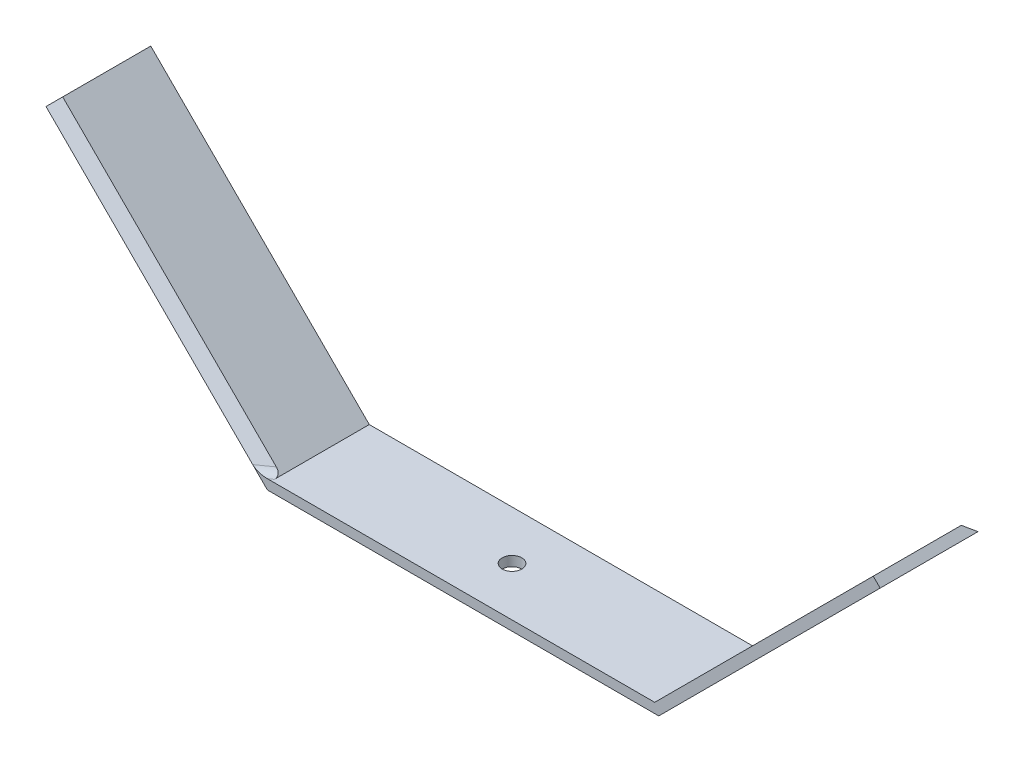
ISO-10303-21;
HEADER;
FILE_DESCRIPTION(('STEP AP214'),'2;1');
FILE_NAME('part.step','',(''),(''),'','','');
FILE_SCHEMA(('AUTOMOTIVE_DESIGN { 1 0 10303 214 1 1 1 1 }'));
ENDSEC;
DATA;
#1=APPLICATION_CONTEXT('core data for automotive mechanical design processes');
#2=APPLICATION_PROTOCOL_DEFINITION('international standard','automotive_design',2000,#1);
#3=PRODUCT_CONTEXT('',#1,'mechanical');
#4=PRODUCT('Part','Part','',(#3));
#5=PRODUCT_RELATED_PRODUCT_CATEGORY('part','',(#4));
#6=PRODUCT_DEFINITION_FORMATION('','',#4);
#7=PRODUCT_DEFINITION_CONTEXT('part definition',#1,'design');
#8=PRODUCT_DEFINITION('design','',#6,#7);
#9=PRODUCT_DEFINITION_SHAPE('','',#8);
#10=(LENGTH_UNIT() NAMED_UNIT(*) SI_UNIT(.MILLI.,.METRE.));
#11=(NAMED_UNIT(*) PLANE_ANGLE_UNIT() SI_UNIT($,.RADIAN.));
#12=(NAMED_UNIT(*) SI_UNIT($,.STERADIAN.) SOLID_ANGLE_UNIT());
#13=UNCERTAINTY_MEASURE_WITH_UNIT(LENGTH_MEASURE(1.E-05),#10,'distance_accuracy_value','');
#14=(GEOMETRIC_REPRESENTATION_CONTEXT(3) GLOBAL_UNCERTAINTY_ASSIGNED_CONTEXT((#13)) GLOBAL_UNIT_ASSIGNED_CONTEXT((#10,
#11,#12)) REPRESENTATION_CONTEXT('',''));
#15=CARTESIAN_POINT('',(0.,0.,0.));
#16=DIRECTION('',(0.,0.,1.));
#17=DIRECTION('',(1.,0.,0.));
#18=AXIS2_PLACEMENT_3D('',#15,#16,#17);
#19=CARTESIAN_POINT('',(-20.,0.,10.));
#20=DIRECTION('',(0.707106781186538,0.707106781186557,0.));
#21=DIRECTION('',(-0.707106781186557,0.707106781186538,0.));
#22=AXIS2_PLACEMENT_3D('',#19,#20,#21);
#23=PLANE('',#22);
#24=DIRECTION('',(0.707106781186557,-0.707106781186538,0.));
#25=VECTOR('',#24,1.);
#26=CARTESIAN_POINT('',(-20.,0.,0.));
#27=LINE('',#26,#25);
#28=CARTESIAN_POINT('',(-42.6274169979698,22.6274169979692,0.));
#29=VERTEX_POINT('',#28);
#30=CARTESIAN_POINT('',(-20.,0.,0.));
#31=VERTEX_POINT('',#30);
#32=EDGE_CURVE('E136',#29,#31,#27,.T.);
#33=ORIENTED_EDGE('',*,*,#32,.T.);
#34=DIRECTION('',(0.,0.,-1.));
#35=VECTOR('',#34,1.);
#36=CARTESIAN_POINT('',(-20.,0.,10.));
#37=LINE('',#36,#35);
#38=CARTESIAN_POINT('',(-20.,0.,10.));
#39=VERTEX_POINT('',#38);
#40=EDGE_CURVE('E128',#39,#31,#37,.T.);
#41=ORIENTED_EDGE('',*,*,#40,.F.);
#42=DIRECTION('',(0.707106781186557,-0.707106781186538,0.));
#43=VECTOR('',#42,1.);
#44=CARTESIAN_POINT('',(-20.,0.,10.));
#45=LINE('',#44,#43);
#46=CARTESIAN_POINT('',(-21.5,1.49999999999999,10.));
#47=VERTEX_POINT('',#46);
#48=EDGE_CURVE('E47',#47,#39,#45,.T.);
#49=ORIENTED_EDGE('',*,*,#48,.F.);
#50=CARTESIAN_POINT('',(-42.6274169979698,22.6274169979692,10.));
#51=VERTEX_POINT('',#50);
#52=EDGE_CURVE('E122',#51,#47,#45,.T.);
#53=ORIENTED_EDGE('',*,*,#52,.F.);
#54=DIRECTION('',(0.,0.,-1.));
#55=VECTOR('',#54,1.);
#56=CARTESIAN_POINT('',(-42.6274169979698,22.6274169979692,10.));
#57=LINE('',#56,#55);
#58=EDGE_CURVE('E198',#51,#29,#57,.T.);
#59=ORIENTED_EDGE('',*,*,#58,.T.);
#60=EDGE_LOOP('',(#33,#41,#49,#53,#59));
#61=FACE_BOUND('',#60,.T.);
#62=ADVANCED_FACE('F32',(#61),#23,.F.);
#63=CARTESIAN_POINT('',(20.,0.,10.));
#64=DIRECTION('',(0.,1.,0.));
#65=DIRECTION('',(0.,0.,1.));
#66=AXIS2_PLACEMENT_3D('',#63,#64,#65);
#67=PLANE('',#66);
#68=CARTESIAN_POINT('',(0.,0.,5.));
#69=DIRECTION('',(0.,1.,0.));
#70=DIRECTION('',(0.,0.,1.));
#71=AXIS2_PLACEMENT_3D('',#68,#69,#70);
#72=CIRCLE('',#71,1.);
#73=CARTESIAN_POINT('',(0.,0.,6.));
#74=VERTEX_POINT('',#73);
#75=EDGE_CURVE('E218',#74,#74,#72,.T.);
#76=ORIENTED_EDGE('',*,*,#75,.T.);
#77=EDGE_LOOP('',(#76));
#78=FACE_BOUND('',#77,.T.);
#79=DIRECTION('',(1.,0.,0.));
#80=VECTOR('',#79,1.);
#81=CARTESIAN_POINT('',(20.,0.,0.));
#82=LINE('',#81,#80);
#83=CARTESIAN_POINT('',(20.,0.,0.));
#84=VERTEX_POINT('',#83);
#85=EDGE_CURVE('E217',#31,#84,#82,.T.);
#86=ORIENTED_EDGE('',*,*,#85,.T.);
#87=DIRECTION('',(0.,0.,-1.));
#88=VECTOR('',#87,1.);
#89=CARTESIAN_POINT('',(20.,0.,10.));
#90=LINE('',#89,#88);
#91=CARTESIAN_POINT('',(20.,0.,10.));
#92=VERTEX_POINT('',#91);
#93=EDGE_CURVE('E130',#92,#84,#90,.T.);
#94=ORIENTED_EDGE('',*,*,#93,.F.);
#95=DIRECTION('',(1.,0.,0.));
#96=VECTOR('',#95,1.);
#97=CARTESIAN_POINT('',(20.,0.,10.));
#98=LINE('',#97,#96);
#99=EDGE_CURVE('E119',#39,#92,#98,.T.);
#100=ORIENTED_EDGE('',*,*,#99,.F.);
#101=ORIENTED_EDGE('',*,*,#40,.T.);
#102=EDGE_LOOP('',(#86,#94,#100,#101));
#103=FACE_BOUND('',#102,.T.);
#104=ADVANCED_FACE('F127',(#78,#103),#67,.F.);
#105=CARTESIAN_POINT('',(20.,0.,10.));
#106=DIRECTION('',(-0.707106781186538,0.707106781186557,0.));
#107=DIRECTION('',(-0.707106781186557,-0.707106781186538,0.));
#108=AXIS2_PLACEMENT_3D('',#105,#106,#107);
#109=PLANE('',#108);
#110=DIRECTION('',(0.707106781186557,0.707106781186538,0.));
#111=VECTOR('',#110,1.);
#112=CARTESIAN_POINT('',(20.,0.,0.));
#113=LINE('',#112,#111);
#114=CARTESIAN_POINT('',(21.5,1.49999999999999,0.));
#115=VERTEX_POINT('',#114);
#116=EDGE_CURVE('E55',#84,#115,#113,.T.);
#117=ORIENTED_EDGE('',*,*,#116,.T.);
#118=CARTESIAN_POINT('',(42.6274169979698,22.6274169979692,0.));
#119=VERTEX_POINT('',#118);
#120=EDGE_CURVE('E193',#115,#119,#113,.T.);
#121=ORIENTED_EDGE('',*,*,#120,.T.);
#122=DIRECTION('',(0.,0.,-1.));
#123=VECTOR('',#122,1.);
#124=CARTESIAN_POINT('',(42.6274169979698,22.6274169979692,10.));
#125=LINE('',#124,#123);
#126=CARTESIAN_POINT('',(42.6274169979698,22.6274169979692,10.));
#127=VERTEX_POINT('',#126);
#128=EDGE_CURVE('E142',#127,#119,#125,.T.);
#129=ORIENTED_EDGE('',*,*,#128,.F.);
#130=DIRECTION('',(0.707106781186557,0.707106781186538,0.));
#131=VECTOR('',#130,1.);
#132=CARTESIAN_POINT('',(20.,0.,10.));
#133=LINE('',#132,#131);
#134=EDGE_CURVE('E132',#92,#127,#133,.T.);
#135=ORIENTED_EDGE('',*,*,#134,.F.);
#136=ORIENTED_EDGE('',*,*,#93,.T.);
#137=EDGE_LOOP('',(#117,#121,#129,#135,#136));
#138=FACE_BOUND('',#137,.T.);
#139=ADVANCED_FACE('F251',(#138),#109,.F.);
#140=CARTESIAN_POINT('',(42.6274169979698,22.6274169979692,10.));
#141=DIRECTION('',(-0.707106781186556,-0.707106781186539,0.));
#142=DIRECTION('',(0.707106781186539,-0.707106781186556,0.));
#143=AXIS2_PLACEMENT_3D('',#140,#141,#142);
#144=PLANE('',#143);
#145=ORIENTED_EDGE('',*,*,#128,.T.);
#146=DIRECTION('',(-0.499999999999994,0.500000000000006,0.707106781186548));
#147=VECTOR('',#146,1.);
#148=CARTESIAN_POINT('',(41.9203102167833,23.3345237791558,1.));
#149=LINE('',#148,#147);
#150=CARTESIAN_POINT('',(41.9203102167833,23.3345237791558,1.));
#151=VERTEX_POINT('',#150);
#152=EDGE_CURVE('E140',#119,#151,#149,.T.);
#153=ORIENTED_EDGE('',*,*,#152,.T.);
#154=DIRECTION('',(0.,0.,-1.));
#155=VECTOR('',#154,1.);
#156=CARTESIAN_POINT('',(41.9203102167833,23.3345237791558,10.));
#157=LINE('',#156,#155);
#158=CARTESIAN_POINT('',(41.9203102167833,23.3345237791558,10.));
#159=VERTEX_POINT('',#158);
#160=EDGE_CURVE('E206',#159,#151,#157,.T.);
#161=ORIENTED_EDGE('',*,*,#160,.F.);
#162=DIRECTION('',(-0.707106781186539,0.707106781186556,0.));
#163=VECTOR('',#162,1.);
#164=CARTESIAN_POINT('',(42.6274169979698,22.6274169979692,10.));
#165=LINE('',#164,#163);
#166=EDGE_CURVE('E214',#127,#159,#165,.T.);
#167=ORIENTED_EDGE('',*,*,#166,.F.);
#168=EDGE_LOOP('',(#145,#153,#161,#167));
#169=FACE_BOUND('',#168,.T.);
#170=ADVANCED_FACE('F212',(#169),#144,.F.);
#171=CARTESIAN_POINT('',(41.9203102167833,23.3345237791558,10.));
#172=DIRECTION('',(0.707106781186538,-0.707106781186557,0.));
#173=DIRECTION('',(0.707106781186557,0.707106781186538,0.));
#174=AXIS2_PLACEMENT_3D('',#171,#172,#173);
#175=PLANE('',#174);
#176=ORIENTED_EDGE('',*,*,#160,.T.);
#177=DIRECTION('',(-0.707106781186557,-0.707106781186538,0.));
#178=VECTOR('',#177,1.);
#179=CARTESIAN_POINT('',(19.5857864376269,0.999999999999997,1.));
#180=LINE('',#179,#178);
#181=CARTESIAN_POINT('',(20.0857864376269,1.49999999999999,1.));
#182=VERTEX_POINT('',#181);
#183=EDGE_CURVE('E137',#151,#182,#180,.T.);
#184=ORIENTED_EDGE('',*,*,#183,.T.);
#185=CARTESIAN_POINT('',(20.5857864376269,2.,-0.414213562373096));
#186=DIRECTION('',(0.707106781186538,-0.707106781186557,0.));
#187=DIRECTION('',(0.500000000000013,0.5,-0.707106781186538));
#188=AXIS2_PLACEMENT_3D('',#185,#186,#187);
#189=ELLIPSE('',#188,1.73205080756889,1.);
#190=CARTESIAN_POINT('',(19.5857864376269,0.999999999999997,0.292893218813461));
#191=VERTEX_POINT('',#190);
#192=EDGE_CURVE('E165',#182,#191,#189,.T.);
#193=ORIENTED_EDGE('',*,*,#192,.T.);
#194=DIRECTION('',(0.,0.,-1.));
#195=VECTOR('',#194,1.);
#196=CARTESIAN_POINT('',(19.5857864376269,0.999999999999997,10.));
#197=LINE('',#196,#195);
#198=CARTESIAN_POINT('',(19.5857864376269,0.999999999999997,10.));
#199=VERTEX_POINT('',#198);
#200=EDGE_CURVE('E174',#199,#191,#197,.T.);
#201=ORIENTED_EDGE('',*,*,#200,.F.);
#202=DIRECTION('',(-0.707106781186557,-0.707106781186538,0.));
#203=VECTOR('',#202,1.);
#204=CARTESIAN_POINT('',(41.9203102167833,23.3345237791558,10.));
#205=LINE('',#204,#203);
#206=EDGE_CURVE('E222',#159,#199,#205,.T.);
#207=ORIENTED_EDGE('',*,*,#206,.F.);
#208=EDGE_LOOP('',(#176,#184,#193,#201,#207));
#209=FACE_BOUND('',#208,.T.);
#210=ADVANCED_FACE('F172',(#209),#175,.F.);
#211=CARTESIAN_POINT('',(-19.5857864376269,0.999999999999994,10.));
#212=DIRECTION('',(0.,-1.,0.));
#213=DIRECTION('',(1.,0.,0.));
#214=AXIS2_PLACEMENT_3D('',#211,#212,#213);
#215=PLANE('',#214);
#216=CARTESIAN_POINT('',(0.,0.999999999999996,5.));
#217=DIRECTION('',(0.,1.,0.));
#218=DIRECTION('',(-1.,0.,0.));
#219=AXIS2_PLACEMENT_3D('',#216,#217,#218);
#220=CIRCLE('',#219,1.);
#221=CARTESIAN_POINT('',(-1.,0.999999999999996,5.));
#222=VERTEX_POINT('',#221);
#223=EDGE_CURVE('E228',#222,#222,#220,.T.);
#224=ORIENTED_EDGE('',*,*,#223,.F.);
#225=EDGE_LOOP('',(#224));
#226=FACE_BOUND('',#225,.T.);
#227=ORIENTED_EDGE('',*,*,#200,.T.);
#228=DIRECTION('',(0.81649658092773,0.,-0.577350269189621));
#229=VECTOR('',#228,1.);
#230=CARTESIAN_POINT('',(-11.1045694996618,0.999999999999995,21.9942520190988));
#231=LINE('',#230,#229);
#232=CARTESIAN_POINT('',(20.,0.999999999999997,0.));
#233=VERTEX_POINT('',#232);
#234=EDGE_CURVE('E155',#191,#233,#231,.T.);
#235=ORIENTED_EDGE('',*,*,#234,.T.);
#236=DIRECTION('',(-1.,0.,0.));
#237=VECTOR('',#236,1.);
#238=CARTESIAN_POINT('',(-19.5857864376269,0.999999999999994,0.));
#239=LINE('',#238,#237);
#240=CARTESIAN_POINT('',(-19.5857864376269,0.999999999999994,0.));
#241=VERTEX_POINT('',#240);
#242=EDGE_CURVE('E183',#233,#241,#239,.T.);
#243=ORIENTED_EDGE('',*,*,#242,.T.);
#244=DIRECTION('',(0.,0.,-1.));
#245=VECTOR('',#244,1.);
#246=CARTESIAN_POINT('',(-19.5857864376269,0.999999999999994,10.));
#247=LINE('',#246,#245);
#248=CARTESIAN_POINT('',(-19.5857864376269,0.999999999999994,9.70710678118653));
#249=VERTEX_POINT('',#248);
#250=EDGE_CURVE('E203',#249,#241,#247,.T.);
#251=ORIENTED_EDGE('',*,*,#250,.F.);
#252=DIRECTION('',(0.816496580927731,0.,-0.577350269189619));
#253=VECTOR('',#252,1.);
#254=CARTESIAN_POINT('',(-19.7238576250846,0.999999999999994,9.80473785412435));
#255=LINE('',#254,#253);
#256=CARTESIAN_POINT('',(-20.,0.999999999999994,10.));
#257=VERTEX_POINT('',#256);
#258=EDGE_CURVE('E152',#249,#257,#255,.F.);
#259=ORIENTED_EDGE('',*,*,#258,.T.);
#260=DIRECTION('',(-1.,0.,0.));
#261=VECTOR('',#260,1.);
#262=CARTESIAN_POINT('',(-19.5857864376269,0.999999999999994,10.));
#263=LINE('',#262,#261);
#264=EDGE_CURVE('E201',#199,#257,#263,.T.);
#265=ORIENTED_EDGE('',*,*,#264,.F.);
#266=EDGE_LOOP('',(#227,#235,#243,#251,#259,#265));
#267=FACE_BOUND('',#266,.T.);
#268=ADVANCED_FACE('F182',(#226,#267),#215,.F.);
#269=CARTESIAN_POINT('',(-41.9203102167833,23.3345237791558,10.));
#270=DIRECTION('',(-0.707106781186538,-0.707106781186557,0.));
#271=DIRECTION('',(0.707106781186557,-0.707106781186538,0.));
#272=AXIS2_PLACEMENT_3D('',#269,#270,#271);
#273=PLANE('',#272);
#274=DIRECTION('',(0.,0.,-1.));
#275=VECTOR('',#274,1.);
#276=CARTESIAN_POINT('',(-41.9203102167833,23.3345237791558,10.));
#277=LINE('',#276,#275);
#278=CARTESIAN_POINT('',(-41.9203102167833,23.3345237791558,9.));
#279=VERTEX_POINT('',#278);
#280=CARTESIAN_POINT('',(-41.9203102167833,23.3345237791558,0.));
#281=VERTEX_POINT('',#280);
#282=EDGE_CURVE('E200',#279,#281,#277,.T.);
#283=ORIENTED_EDGE('',*,*,#282,.F.);
#284=DIRECTION('',(0.707106781186557,-0.707106781186538,0.));
#285=VECTOR('',#284,1.);
#286=CARTESIAN_POINT('',(-41.9203102167833,23.3345237791558,9.));
#287=LINE('',#286,#285);
#288=CARTESIAN_POINT('',(-20.0857864376269,1.49999999999999,9.));
#289=VERTEX_POINT('',#288);
#290=EDGE_CURVE('E149',#279,#289,#287,.T.);
#291=ORIENTED_EDGE('',*,*,#290,.T.);
#292=CARTESIAN_POINT('',(-20.5857864376269,1.99999999999999,10.4142135623731));
#293=DIRECTION('',(-0.707106781186538,-0.707106781186557,0.));
#294=DIRECTION('',(0.500000000000014,-0.500000000000001,-0.707106781186537));
#295=AXIS2_PLACEMENT_3D('',#292,#293,#294);
#296=ELLIPSE('',#295,1.73205080756889,1.);
#297=EDGE_CURVE('E11',#289,#249,#296,.T.);
#298=ORIENTED_EDGE('',*,*,#297,.T.);
#299=ORIENTED_EDGE('',*,*,#250,.T.);
#300=DIRECTION('',(-0.707106781186557,0.707106781186538,0.));
#301=VECTOR('',#300,1.);
#302=CARTESIAN_POINT('',(-41.9203102167833,23.3345237791558,0.));
#303=LINE('',#302,#301);
#304=EDGE_CURVE('E190',#241,#281,#303,.T.);
#305=ORIENTED_EDGE('',*,*,#304,.T.);
#306=EDGE_LOOP('',(#283,#291,#298,#299,#305));
#307=FACE_BOUND('',#306,.T.);
#308=ADVANCED_FACE('F236',(#307),#273,.F.);
#309=CARTESIAN_POINT('',(-42.6274169979698,22.6274169979692,10.));
#310=DIRECTION('',(0.707106781186568,-0.707106781186527,0.));
#311=DIRECTION('',(0.707106781186527,0.707106781186568,0.));
#312=AXIS2_PLACEMENT_3D('',#309,#310,#311);
#313=PLANE('',#312);
#314=ORIENTED_EDGE('',*,*,#58,.F.);
#315=DIRECTION('',(-0.499999999999986,-0.500000000000016,0.707106781186546));
#316=VECTOR('',#315,1.);
#317=CARTESIAN_POINT('',(-42.6274169979701,22.627416997969,10.0000000000004));
#318=LINE('',#317,#316);
#319=EDGE_CURVE('E147',#51,#279,#318,.F.);
#320=ORIENTED_EDGE('',*,*,#319,.T.);
#321=ORIENTED_EDGE('',*,*,#282,.T.);
#322=DIRECTION('',(-0.707106781186527,-0.707106781186568,0.));
#323=VECTOR('',#322,1.);
#324=CARTESIAN_POINT('',(-42.6274169979698,22.6274169979692,0.));
#325=LINE('',#324,#323);
#326=EDGE_CURVE('E123',#281,#29,#325,.T.);
#327=ORIENTED_EDGE('',*,*,#326,.T.);
#328=EDGE_LOOP('',(#314,#320,#321,#327));
#329=FACE_BOUND('',#328,.T.);
#330=ADVANCED_FACE('F242',(#329),#313,.F.);
#331=CARTESIAN_POINT('',(0.,0.,10.));
#332=DIRECTION('',(0.,0.,-1.));
#333=DIRECTION('',(-1.,0.,0.));
#334=AXIS2_PLACEMENT_3D('',#331,#332,#333);
#335=PLANE('',#334);
#336=ORIENTED_EDGE('',*,*,#264,.T.);
#337=CARTESIAN_POINT('',(-20.,1.99999999999999,10.));
#338=DIRECTION('',(0.,0.,-1.));
#339=DIRECTION('',(1.,0.,0.));
#340=AXIS2_PLACEMENT_3D('',#337,#338,#339);
#341=ELLIPSE('',#340,1.7320508075689,1.);
#342=EDGE_CURVE('E40',#257,#47,#341,.T.);
#343=ORIENTED_EDGE('',*,*,#342,.T.);
#344=ORIENTED_EDGE('',*,*,#48,.T.);
#345=ORIENTED_EDGE('',*,*,#99,.T.);
#346=ORIENTED_EDGE('',*,*,#134,.T.);
#347=ORIENTED_EDGE('',*,*,#166,.T.);
#348=ORIENTED_EDGE('',*,*,#206,.T.);
#349=EDGE_LOOP('',(#336,#343,#344,#345,#346,#347,#348));
#350=FACE_BOUND('',#349,.T.);
#351=ADVANCED_FACE('F118',(#350),#335,.F.);
#352=CARTESIAN_POINT('',(0.,0.,0.));
#353=DIRECTION('',(0.,0.,-1.));
#354=DIRECTION('',(-1.,0.,0.));
#355=AXIS2_PLACEMENT_3D('',#352,#353,#354);
#356=PLANE('',#355);
#357=ORIENTED_EDGE('',*,*,#242,.F.);
#358=CARTESIAN_POINT('',(20.,2.,0.));
#359=DIRECTION('',(0.,0.,-1.));
#360=DIRECTION('',(1.,0.,0.));
#361=AXIS2_PLACEMENT_3D('',#358,#359,#360);
#362=ELLIPSE('',#361,1.73205080756889,1.);
#363=EDGE_CURVE('E162',#233,#115,#362,.F.);
#364=ORIENTED_EDGE('',*,*,#363,.T.);
#365=ORIENTED_EDGE('',*,*,#116,.F.);
#366=ORIENTED_EDGE('',*,*,#85,.F.);
#367=ORIENTED_EDGE('',*,*,#32,.F.);
#368=ORIENTED_EDGE('',*,*,#326,.F.);
#369=ORIENTED_EDGE('',*,*,#304,.F.);
#370=EDGE_LOOP('',(#357,#364,#365,#366,#367,#368,#369));
#371=FACE_BOUND('',#370,.T.);
#372=ADVANCED_FACE('F187',(#371),#356,.T.);
#373=CARTESIAN_POINT('',(41.9203102167833,23.3345237791558,1.));
#374=DIRECTION('',(-0.499999999999993,0.500000000000007,-0.707106781186547));
#375=DIRECTION('',(0.707106781186557,0.707106781186538,0.));
#376=AXIS2_PLACEMENT_3D('',#373,#374,#375);
#377=PLANE('',#376);
#378=ORIENTED_EDGE('',*,*,#120,.F.);
#379=DIRECTION('',(0.81649658092773,0.,-0.577350269189621));
#380=VECTOR('',#379,1.);
#381=CARTESIAN_POINT('',(34.6421356237313,1.49999999999999,-9.29289321881354));
#382=LINE('',#381,#380);
#383=EDGE_CURVE('E158',#115,#182,#382,.F.);
#384=ORIENTED_EDGE('',*,*,#383,.T.);
#385=ORIENTED_EDGE('',*,*,#183,.F.);
#386=ORIENTED_EDGE('',*,*,#152,.F.);
#387=EDGE_LOOP('',(#378,#384,#385,#386));
#388=FACE_BOUND('',#387,.T.);
#389=ADVANCED_FACE('F216',(#388),#377,.T.);
#390=CARTESIAN_POINT('',(-9.99999999999974,-10.,10.));
#391=DIRECTION('',(-0.499999999999993,-0.500000000000006,-0.707106781186549));
#392=DIRECTION('',(-0.707106781186557,0.707106781186538,0.));
#393=AXIS2_PLACEMENT_3D('',#390,#391,#392);
#394=PLANE('',#393);
#395=ORIENTED_EDGE('',*,*,#52,.T.);
#396=DIRECTION('',(-0.816496580927731,0.,0.577350269189619));
#397=VECTOR('',#396,1.);
#398=CARTESIAN_POINT('',(-13.8333333333331,1.49999999999999,4.57884801090303));
#399=LINE('',#398,#397);
#400=EDGE_CURVE('E160',#47,#289,#399,.F.);
#401=ORIENTED_EDGE('',*,*,#400,.T.);
#402=ORIENTED_EDGE('',*,*,#290,.F.);
#403=ORIENTED_EDGE('',*,*,#319,.F.);
#404=EDGE_LOOP('',(#395,#401,#402,#403));
#405=FACE_BOUND('',#404,.T.);
#406=ADVANCED_FACE('F258',(#405),#394,.F.);
#407=CARTESIAN_POINT('',(-11.1045694996618,1.99999999999999,21.9942520190988));
#408=DIRECTION('',(0.816496580927729,0.,-0.577350269189621));
#409=DIRECTION('',(-0.577350269189621,0.,-0.81649658092773));
#410=AXIS2_PLACEMENT_3D('',#407,#408,#409);
#411=CYLINDRICAL_SURFACE('',#410,1.);
#412=ORIENTED_EDGE('',*,*,#192,.F.);
#413=ORIENTED_EDGE('',*,*,#383,.F.);
#414=ORIENTED_EDGE('',*,*,#363,.F.);
#415=ORIENTED_EDGE('',*,*,#234,.F.);
#416=EDGE_LOOP('',(#412,#413,#414,#415));
#417=FACE_BOUND('',#416,.T.);
#418=ADVANCED_FACE('F179',(#417),#411,.F.);
#419=CARTESIAN_POINT('',(-19.7238576250846,1.99999999999999,9.80473785412435));
#420=DIRECTION('',(0.81649658092773,0.,-0.577350269189619));
#421=DIRECTION('',(-0.577350269189619,0.,-0.816496580927731));
#422=AXIS2_PLACEMENT_3D('',#419,#420,#421);
#423=CYLINDRICAL_SURFACE('',#422,1.);
#424=ORIENTED_EDGE('',*,*,#297,.F.);
#425=ORIENTED_EDGE('',*,*,#400,.F.);
#426=ORIENTED_EDGE('',*,*,#342,.F.);
#427=ORIENTED_EDGE('',*,*,#258,.F.);
#428=EDGE_LOOP('',(#424,#425,#426,#427));
#429=FACE_BOUND('',#428,.T.);
#430=ADVANCED_FACE('F34',(#429),#423,.F.);
#431=CARTESIAN_POINT('',(0.,-9.00000000000001,5.));
#432=DIRECTION('',(0.,1.,0.));
#433=DIRECTION('',(-1.,0.,0.));
#434=AXIS2_PLACEMENT_3D('',#431,#432,#433);
#435=CYLINDRICAL_SURFACE('',#434,1.);
#436=ORIENTED_EDGE('',*,*,#223,.T.);
#437=EDGE_LOOP('',(#436));
#438=FACE_BOUND('',#437,.T.);
#439=ORIENTED_EDGE('',*,*,#75,.F.);
#440=EDGE_LOOP('',(#439));
#441=FACE_BOUND('',#440,.T.);
#442=ADVANCED_FACE('F232',(#438,#441),#435,.F.);
#443=CLOSED_SHELL('',(#62,#104,#139,#170,#210,#268,#308,#330,#351,#372,#389,#406,#418,#430,#442));
#444=MANIFOLD_SOLID_BREP('B2',#443);
#445=ADVANCED_BREP_SHAPE_REPRESENTATION('',(#18,#444),#14);
#446=SHAPE_DEFINITION_REPRESENTATION(#9,#445);
ENDSEC;
END-ISO-10303-21;
